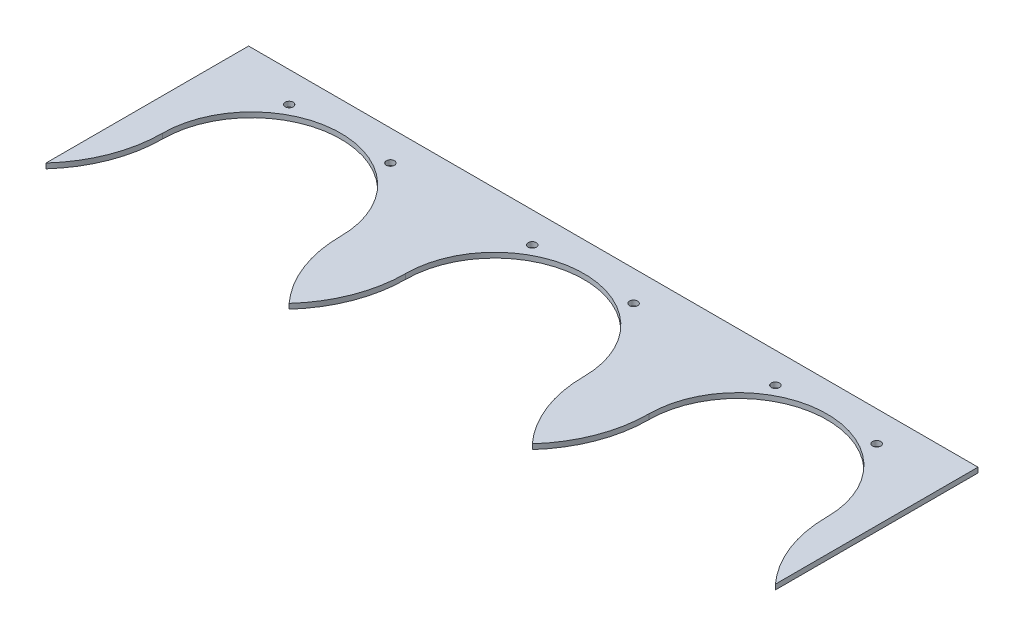
ISO-10303-21;
HEADER;
FILE_DESCRIPTION(('STEP AP214'),'2;1');
FILE_NAME('part.step','',(''),(''),'','','');
FILE_SCHEMA(('AUTOMOTIVE_DESIGN { 1 0 10303 214 1 1 1 1 }'));
ENDSEC;
DATA;
#1=APPLICATION_CONTEXT('core data for automotive mechanical design processes');
#2=APPLICATION_PROTOCOL_DEFINITION('international standard','automotive_design',2000,#1);
#3=PRODUCT_CONTEXT('',#1,'mechanical');
#4=PRODUCT('Part','Part','',(#3));
#5=PRODUCT_RELATED_PRODUCT_CATEGORY('part','',(#4));
#6=PRODUCT_DEFINITION_FORMATION('','',#4);
#7=PRODUCT_DEFINITION_CONTEXT('part definition',#1,'design');
#8=PRODUCT_DEFINITION('design','',#6,#7);
#9=PRODUCT_DEFINITION_SHAPE('','',#8);
#10=(LENGTH_UNIT() NAMED_UNIT(*) SI_UNIT(.MILLI.,.METRE.));
#11=(NAMED_UNIT(*) PLANE_ANGLE_UNIT() SI_UNIT($,.RADIAN.));
#12=(NAMED_UNIT(*) SI_UNIT($,.STERADIAN.) SOLID_ANGLE_UNIT());
#13=UNCERTAINTY_MEASURE_WITH_UNIT(LENGTH_MEASURE(1.E-05),#10,'distance_accuracy_value','');
#14=(GEOMETRIC_REPRESENTATION_CONTEXT(3) GLOBAL_UNCERTAINTY_ASSIGNED_CONTEXT((#13)) GLOBAL_UNIT_ASSIGNED_CONTEXT((#10,
#11,#12)) REPRESENTATION_CONTEXT('',''));
#15=CARTESIAN_POINT('',(0.,0.,0.));
#16=DIRECTION('',(0.,0.,1.));
#17=DIRECTION('',(1.,0.,0.));
#18=AXIS2_PLACEMENT_3D('',#15,#16,#17);
#19=CARTESIAN_POINT('',(-203.873238202378,-3.175,11.6934234359103));
#20=DIRECTION('',(0.,1.,0.));
#21=DIRECTION('',(0.,0.,1.));
#22=AXIS2_PLACEMENT_3D('',#19,#20,#21);
#23=CYLINDRICAL_SURFACE('',#22,55.88);
#24=CARTESIAN_POINT('',(-203.873238202378,0.,11.6934234359103));
#25=DIRECTION('',(0.,1.,0.));
#26=DIRECTION('',(0.,0.,1.));
#27=AXIS2_PLACEMENT_3D('',#24,#25,#26);
#28=CIRCLE('',#27,55.88);
#29=CARTESIAN_POINT('',(-147.993238202378,0.,11.6934234359104));
#30=VERTEX_POINT('',#29);
#31=CARTESIAN_POINT('',(-259.753238202378,0.,11.6934234359103));
#32=VERTEX_POINT('',#31);
#33=EDGE_CURVE('E174',#30,#32,#28,.T.);
#34=ORIENTED_EDGE('',*,*,#33,.T.);
#35=DIRECTION('',(0.,1.,0.));
#36=VECTOR('',#35,1.);
#37=CARTESIAN_POINT('',(-259.753238202378,-3.175,11.6934234359103));
#38=LINE('',#37,#36);
#39=CARTESIAN_POINT('',(-259.753238202378,-3.175,11.6934234359103));
#40=VERTEX_POINT('',#39);
#41=EDGE_CURVE('E11',#40,#32,#38,.T.);
#42=ORIENTED_EDGE('',*,*,#41,.F.);
#43=CARTESIAN_POINT('',(-203.873238202378,-3.175,11.6934234359103));
#44=DIRECTION('',(0.,1.,0.));
#45=DIRECTION('',(0.,0.,1.));
#46=AXIS2_PLACEMENT_3D('',#43,#44,#45);
#47=CIRCLE('',#46,55.88);
#48=CARTESIAN_POINT('',(-147.993238202378,-3.175,11.6934234359104));
#49=VERTEX_POINT('',#48);
#50=EDGE_CURVE('E235',#49,#40,#47,.T.);
#51=ORIENTED_EDGE('',*,*,#50,.F.);
#52=DIRECTION('',(0.,1.,0.));
#53=VECTOR('',#52,1.);
#54=CARTESIAN_POINT('',(-147.993238202378,-3.175,11.6934234359104));
#55=LINE('',#54,#53);
#56=EDGE_CURVE('E40',#49,#30,#55,.T.);
#57=ORIENTED_EDGE('',*,*,#56,.T.);
#58=EDGE_LOOP('',(#34,#42,#51,#57));
#59=FACE_BOUND('',#58,.T.);
#60=ADVANCED_FACE('F36',(#59),#23,.F.);
#61=CARTESIAN_POINT('',(-338.265035077378,-3.175,11.6934234359103));
#62=DIRECTION('',(0.,1.,0.));
#63=DIRECTION('',(0.,0.,1.));
#64=AXIS2_PLACEMENT_3D('',#61,#62,#63);
#65=CYLINDRICAL_SURFACE('',#64,78.511796875);
#66=CARTESIAN_POINT('',(-338.265035077378,0.,11.6934234359103));
#67=DIRECTION('',(0.,1.,0.));
#68=DIRECTION('',(0.,0.,1.));
#69=AXIS2_PLACEMENT_3D('',#66,#67,#68);
#70=CIRCLE('',#69,78.511796875);
#71=CARTESIAN_POINT('',(-280.073238202378,0.,64.3984234359103));
#72=VERTEX_POINT('',#71);
#73=EDGE_CURVE('E100',#32,#72,#70,.F.);
#74=ORIENTED_EDGE('',*,*,#73,.T.);
#75=DIRECTION('',(0.,1.,0.));
#76=VECTOR('',#75,1.);
#77=CARTESIAN_POINT('',(-280.073238202378,-3.175,64.3984234359103));
#78=LINE('',#77,#76);
#79=CARTESIAN_POINT('',(-280.073238202378,-3.175,64.3984234359103));
#80=VERTEX_POINT('',#79);
#81=EDGE_CURVE('E46',#80,#72,#78,.T.);
#82=ORIENTED_EDGE('',*,*,#81,.F.);
#83=CARTESIAN_POINT('',(-338.265035077378,-3.175,11.6934234359103));
#84=DIRECTION('',(0.,1.,0.));
#85=DIRECTION('',(0.,0.,1.));
#86=AXIS2_PLACEMENT_3D('',#83,#84,#85);
#87=CIRCLE('',#86,78.511796875);
#88=EDGE_CURVE('E54',#40,#80,#87,.F.);
#89=ORIENTED_EDGE('',*,*,#88,.F.);
#90=ORIENTED_EDGE('',*,*,#41,.T.);
#91=EDGE_LOOP('',(#74,#82,#89,#90));
#92=FACE_BOUND('',#91,.T.);
#93=ADVANCED_FACE('F256',(#92),#65,.T.);
#94=CARTESIAN_POINT('',(-280.073238202378,-3.175,2.48592343591035));
#95=DIRECTION('',(-1.,0.,0.));
#96=DIRECTION('',(0.,0.,1.));
#97=AXIS2_PLACEMENT_3D('',#94,#95,#96);
#98=PLANE('',#97);
#99=DIRECTION('',(0.,0.,1.));
#100=VECTOR('',#99,1.);
#101=CARTESIAN_POINT('',(-280.073238202378,0.,2.48592343591035));
#102=LINE('',#101,#100);
#103=CARTESIAN_POINT('',(-280.073238202378,0.,-62.6015765640897));
#104=VERTEX_POINT('',#103);
#105=EDGE_CURVE('E137',#104,#72,#102,.T.);
#106=ORIENTED_EDGE('',*,*,#105,.F.);
#107=DIRECTION('',(0.,1.,0.));
#108=VECTOR('',#107,1.);
#109=CARTESIAN_POINT('',(-280.073238202378,-3.175,-62.6015765640897));
#110=LINE('',#109,#108);
#111=CARTESIAN_POINT('',(-280.073238202378,-3.175,-62.6015765640897));
#112=VERTEX_POINT('',#111);
#113=EDGE_CURVE('E132',#112,#104,#110,.T.);
#114=ORIENTED_EDGE('',*,*,#113,.F.);
#115=DIRECTION('',(0.,0.,1.));
#116=VECTOR('',#115,1.);
#117=CARTESIAN_POINT('',(-280.073238202378,-3.175,2.48592343591035));
#118=LINE('',#117,#116);
#119=EDGE_CURVE('E136',#112,#80,#118,.T.);
#120=ORIENTED_EDGE('',*,*,#119,.T.);
#121=ORIENTED_EDGE('',*,*,#81,.T.);
#122=EDGE_LOOP('',(#106,#114,#120,#121));
#123=FACE_BOUND('',#122,.T.);
#124=ADVANCED_FACE('F134',(#123),#98,.T.);
#125=CARTESIAN_POINT('',(-421.366345461635,-3.175,-62.6015765640897));
#126=DIRECTION('',(0.,0.,1.));
#127=DIRECTION('',(1.,0.,0.));
#128=AXIS2_PLACEMENT_3D('',#125,#126,#127);
#129=PLANE('',#128);
#130=DIRECTION('',(1.,0.,0.));
#131=VECTOR('',#130,1.);
#132=CARTESIAN_POINT('',(-421.366345461635,0.,-62.6015765640897));
#133=LINE('',#132,#131);
#134=CARTESIAN_POINT('',(177.126761797622,0.,-62.6015765640897));
#135=VERTEX_POINT('',#134);
#136=EDGE_CURVE('E199',#104,#135,#133,.T.);
#137=ORIENTED_EDGE('',*,*,#136,.T.);
#138=DIRECTION('',(0.,1.,0.));
#139=VECTOR('',#138,1.);
#140=CARTESIAN_POINT('',(177.126761797622,-3.175,-62.6015765640897));
#141=LINE('',#140,#139);
#142=CARTESIAN_POINT('',(177.126761797622,-3.175,-62.6015765640897));
#143=VERTEX_POINT('',#142);
#144=EDGE_CURVE('E140',#143,#135,#141,.T.);
#145=ORIENTED_EDGE('',*,*,#144,.F.);
#146=DIRECTION('',(1.,0.,0.));
#147=VECTOR('',#146,1.);
#148=CARTESIAN_POINT('',(-421.366345461635,-3.175,-62.6015765640897));
#149=LINE('',#148,#147);
#150=EDGE_CURVE('E143',#112,#143,#149,.T.);
#151=ORIENTED_EDGE('',*,*,#150,.F.);
#152=ORIENTED_EDGE('',*,*,#113,.T.);
#153=EDGE_LOOP('',(#137,#145,#151,#152));
#154=FACE_BOUND('',#153,.T.);
#155=ADVANCED_FACE('F144',(#154),#129,.F.);
#156=CARTESIAN_POINT('',(177.126761797622,-3.175,2.48592343591022));
#157=DIRECTION('',(-1.,0.,0.));
#158=DIRECTION('',(0.,0.,1.));
#159=AXIS2_PLACEMENT_3D('',#156,#157,#158);
#160=PLANE('',#159);
#161=DIRECTION('',(0.,0.,1.));
#162=VECTOR('',#161,1.);
#163=CARTESIAN_POINT('',(177.126761797622,0.,2.48592343591022));
#164=LINE('',#163,#162);
#165=CARTESIAN_POINT('',(177.126761797622,0.,64.3984234359103));
#166=VERTEX_POINT('',#165);
#167=EDGE_CURVE('E196',#135,#166,#164,.T.);
#168=ORIENTED_EDGE('',*,*,#167,.T.);
#169=DIRECTION('',(0.,1.,0.));
#170=VECTOR('',#169,1.);
#171=CARTESIAN_POINT('',(177.126761797622,-3.175,64.3984234359103));
#172=LINE('',#171,#170);
#173=CARTESIAN_POINT('',(177.126761797622,-3.175,64.3984234359103));
#174=VERTEX_POINT('',#173);
#175=EDGE_CURVE('E218',#174,#166,#172,.T.);
#176=ORIENTED_EDGE('',*,*,#175,.F.);
#177=DIRECTION('',(0.,0.,1.));
#178=VECTOR('',#177,1.);
#179=CARTESIAN_POINT('',(177.126761797622,-3.175,2.48592343591022));
#180=LINE('',#179,#178);
#181=EDGE_CURVE('E148',#143,#174,#180,.T.);
#182=ORIENTED_EDGE('',*,*,#181,.F.);
#183=ORIENTED_EDGE('',*,*,#144,.T.);
#184=EDGE_LOOP('',(#168,#176,#182,#183));
#185=FACE_BOUND('',#184,.T.);
#186=ADVANCED_FACE('F269',(#185),#160,.F.);
#187=CARTESIAN_POINT('',(235.318558672622,-3.175,11.6934234359103));
#188=DIRECTION('',(0.,1.,0.));
#189=DIRECTION('',(0.,0.,1.));
#190=AXIS2_PLACEMENT_3D('',#187,#188,#189);
#191=CYLINDRICAL_SURFACE('',#190,78.5117968750001);
#192=CARTESIAN_POINT('',(235.318558672622,0.,11.6934234359103));
#193=DIRECTION('',(0.,1.,0.));
#194=DIRECTION('',(0.,0.,1.));
#195=AXIS2_PLACEMENT_3D('',#192,#193,#194);
#196=CIRCLE('',#195,78.5117968750001);
#197=CARTESIAN_POINT('',(156.806761797622,0.,11.6934234359103));
#198=VERTEX_POINT('',#197);
#199=EDGE_CURVE('E193',#198,#166,#196,.T.);
#200=ORIENTED_EDGE('',*,*,#199,.F.);
#201=DIRECTION('',(0.,1.,0.));
#202=VECTOR('',#201,1.);
#203=CARTESIAN_POINT('',(156.806761797622,-3.175,11.6934234359103));
#204=LINE('',#203,#202);
#205=CARTESIAN_POINT('',(156.806761797622,-3.175,11.6934234359103));
#206=VERTEX_POINT('',#205);
#207=EDGE_CURVE('E220',#206,#198,#204,.T.);
#208=ORIENTED_EDGE('',*,*,#207,.F.);
#209=CARTESIAN_POINT('',(235.318558672622,-3.175,11.6934234359103));
#210=DIRECTION('',(0.,1.,0.));
#211=DIRECTION('',(0.,0.,1.));
#212=AXIS2_PLACEMENT_3D('',#209,#210,#211);
#213=CIRCLE('',#212,78.5117968750001);
#214=EDGE_CURVE('E320',#206,#174,#213,.T.);
#215=ORIENTED_EDGE('',*,*,#214,.T.);
#216=ORIENTED_EDGE('',*,*,#175,.T.);
#217=EDGE_LOOP('',(#200,#208,#215,#216));
#218=FACE_BOUND('',#217,.T.);
#219=ADVANCED_FACE('F272',(#218),#191,.T.);
#220=CARTESIAN_POINT('',(100.926761797622,-3.175,11.6934234359103));
#221=DIRECTION('',(0.,1.,0.));
#222=DIRECTION('',(0.,0.,1.));
#223=AXIS2_PLACEMENT_3D('',#220,#221,#222);
#224=CYLINDRICAL_SURFACE('',#223,55.88);
#225=CARTESIAN_POINT('',(100.926761797622,0.,11.6934234359103));
#226=DIRECTION('',(0.,1.,0.));
#227=DIRECTION('',(0.,0.,1.));
#228=AXIS2_PLACEMENT_3D('',#225,#226,#227);
#229=CIRCLE('',#228,55.88);
#230=CARTESIAN_POINT('',(45.046761797622,0.,11.6934234359103));
#231=VERTEX_POINT('',#230);
#232=EDGE_CURVE('E191',#198,#231,#229,.T.);
#233=ORIENTED_EDGE('',*,*,#232,.T.);
#234=DIRECTION('',(0.,1.,0.));
#235=VECTOR('',#234,1.);
#236=CARTESIAN_POINT('',(45.046761797622,-3.175,11.6934234359103));
#237=LINE('',#236,#235);
#238=CARTESIAN_POINT('',(45.046761797622,-3.175,11.6934234359103));
#239=VERTEX_POINT('',#238);
#240=EDGE_CURVE('E222',#239,#231,#237,.T.);
#241=ORIENTED_EDGE('',*,*,#240,.F.);
#242=CARTESIAN_POINT('',(100.926761797622,-3.175,11.6934234359103));
#243=DIRECTION('',(0.,1.,0.));
#244=DIRECTION('',(0.,0.,1.));
#245=AXIS2_PLACEMENT_3D('',#242,#243,#244);
#246=CIRCLE('',#245,55.88);
#247=EDGE_CURVE('E321',#206,#239,#246,.T.);
#248=ORIENTED_EDGE('',*,*,#247,.F.);
#249=ORIENTED_EDGE('',*,*,#207,.T.);
#250=EDGE_LOOP('',(#233,#241,#248,#249));
#251=FACE_BOUND('',#250,.T.);
#252=ADVANCED_FACE('F276',(#251),#224,.F.);
#253=CARTESIAN_POINT('',(-33.4650350773781,-3.175,11.6934234359103));
#254=DIRECTION('',(0.,1.,0.));
#255=DIRECTION('',(0.,0.,1.));
#256=AXIS2_PLACEMENT_3D('',#253,#254,#255);
#257=CYLINDRICAL_SURFACE('',#256,78.5117968750001);
#258=CARTESIAN_POINT('',(-33.4650350773781,0.,11.6934234359103));
#259=DIRECTION('',(0.,1.,0.));
#260=DIRECTION('',(0.,0.,1.));
#261=AXIS2_PLACEMENT_3D('',#258,#259,#260);
#262=CIRCLE('',#261,78.5117968750001);
#263=CARTESIAN_POINT('',(24.726761797622,0.,64.3984234359103));
#264=VERTEX_POINT('',#263);
#265=EDGE_CURVE('E188',#231,#264,#262,.F.);
#266=ORIENTED_EDGE('',*,*,#265,.T.);
#267=DIRECTION('',(0.,1.,0.));
#268=VECTOR('',#267,1.);
#269=CARTESIAN_POINT('',(24.726761797622,-3.175,64.3984234359103));
#270=LINE('',#269,#268);
#271=CARTESIAN_POINT('',(24.726761797622,-3.175,64.3984234359103));
#272=VERTEX_POINT('',#271);
#273=EDGE_CURVE('E225',#272,#264,#270,.T.);
#274=ORIENTED_EDGE('',*,*,#273,.F.);
#275=CARTESIAN_POINT('',(-33.4650350773781,-3.175,11.6934234359103));
#276=DIRECTION('',(0.,1.,0.));
#277=DIRECTION('',(0.,0.,1.));
#278=AXIS2_PLACEMENT_3D('',#275,#276,#277);
#279=CIRCLE('',#278,78.5117968750001);
#280=EDGE_CURVE('E325',#239,#272,#279,.F.);
#281=ORIENTED_EDGE('',*,*,#280,.F.);
#282=ORIENTED_EDGE('',*,*,#240,.T.);
#283=EDGE_LOOP('',(#266,#274,#281,#282));
#284=FACE_BOUND('',#283,.T.);
#285=ADVANCED_FACE('F280',(#284),#257,.T.);
#286=CARTESIAN_POINT('',(82.918558672622,-3.175,11.6934234359103));
#287=DIRECTION('',(0.,1.,0.));
#288=DIRECTION('',(0.,0.,1.));
#289=AXIS2_PLACEMENT_3D('',#286,#287,#288);
#290=CYLINDRICAL_SURFACE('',#289,78.5117968750001);
#291=CARTESIAN_POINT('',(82.918558672622,0.,11.6934234359103));
#292=DIRECTION('',(0.,1.,0.));
#293=DIRECTION('',(0.,0.,1.));
#294=AXIS2_PLACEMENT_3D('',#291,#292,#293);
#295=CIRCLE('',#294,78.5117968750001);
#296=CARTESIAN_POINT('',(4.40676179762195,0.,11.6934234359103));
#297=VERTEX_POINT('',#296);
#298=EDGE_CURVE('E185',#297,#264,#295,.T.);
#299=ORIENTED_EDGE('',*,*,#298,.F.);
#300=DIRECTION('',(0.,1.,0.));
#301=VECTOR('',#300,1.);
#302=CARTESIAN_POINT('',(4.40676179762195,-3.175,11.6934234359103));
#303=LINE('',#302,#301);
#304=CARTESIAN_POINT('',(4.40676179762195,-3.175,11.6934234359103));
#305=VERTEX_POINT('',#304);
#306=EDGE_CURVE('E227',#305,#297,#303,.T.);
#307=ORIENTED_EDGE('',*,*,#306,.F.);
#308=CARTESIAN_POINT('',(82.918558672622,-3.175,11.6934234359103));
#309=DIRECTION('',(0.,1.,0.));
#310=DIRECTION('',(0.,0.,1.));
#311=AXIS2_PLACEMENT_3D('',#308,#309,#310);
#312=CIRCLE('',#311,78.5117968750001);
#313=EDGE_CURVE('E310',#305,#272,#312,.T.);
#314=ORIENTED_EDGE('',*,*,#313,.T.);
#315=ORIENTED_EDGE('',*,*,#273,.T.);
#316=EDGE_LOOP('',(#299,#307,#314,#315));
#317=FACE_BOUND('',#316,.T.);
#318=ADVANCED_FACE('F284',(#317),#290,.T.);
#319=CARTESIAN_POINT('',(-51.473238202378,-3.175,11.6934234359103));
#320=DIRECTION('',(0.,1.,0.));
#321=DIRECTION('',(0.,0.,1.));
#322=AXIS2_PLACEMENT_3D('',#319,#320,#321);
#323=CYLINDRICAL_SURFACE('',#322,55.88);
#324=CARTESIAN_POINT('',(-51.473238202378,0.,11.6934234359103));
#325=DIRECTION('',(0.,1.,0.));
#326=DIRECTION('',(0.,0.,1.));
#327=AXIS2_PLACEMENT_3D('',#324,#325,#326);
#328=CIRCLE('',#327,55.88);
#329=CARTESIAN_POINT('',(-107.353238202378,0.,11.6934234359103));
#330=VERTEX_POINT('',#329);
#331=EDGE_CURVE('E183',#297,#330,#328,.T.);
#332=ORIENTED_EDGE('',*,*,#331,.T.);
#333=DIRECTION('',(0.,1.,0.));
#334=VECTOR('',#333,1.);
#335=CARTESIAN_POINT('',(-107.353238202378,-3.175,11.6934234359103));
#336=LINE('',#335,#334);
#337=CARTESIAN_POINT('',(-107.353238202378,-3.175,11.6934234359103));
#338=VERTEX_POINT('',#337);
#339=EDGE_CURVE('E229',#338,#330,#336,.T.);
#340=ORIENTED_EDGE('',*,*,#339,.F.);
#341=CARTESIAN_POINT('',(-51.473238202378,-3.175,11.6934234359103));
#342=DIRECTION('',(0.,1.,0.));
#343=DIRECTION('',(0.,0.,1.));
#344=AXIS2_PLACEMENT_3D('',#341,#342,#343);
#345=CIRCLE('',#344,55.88);
#346=EDGE_CURVE('E328',#305,#338,#345,.T.);
#347=ORIENTED_EDGE('',*,*,#346,.F.);
#348=ORIENTED_EDGE('',*,*,#306,.T.);
#349=EDGE_LOOP('',(#332,#340,#347,#348));
#350=FACE_BOUND('',#349,.T.);
#351=ADVANCED_FACE('F288',(#350),#323,.F.);
#352=CARTESIAN_POINT('',(-185.865035077378,-3.175,11.6934234359103));
#353=DIRECTION('',(0.,1.,0.));
#354=DIRECTION('',(0.,0.,1.));
#355=AXIS2_PLACEMENT_3D('',#352,#353,#354);
#356=CYLINDRICAL_SURFACE('',#355,78.5117968749999);
#357=CARTESIAN_POINT('',(-185.865035077378,0.,11.6934234359103));
#358=DIRECTION('',(0.,1.,0.));
#359=DIRECTION('',(0.,0.,1.));
#360=AXIS2_PLACEMENT_3D('',#357,#358,#359);
#361=CIRCLE('',#360,78.5117968749999);
#362=CARTESIAN_POINT('',(-127.673238202378,0.,64.3984234359103));
#363=VERTEX_POINT('',#362);
#364=EDGE_CURVE('E180',#330,#363,#361,.F.);
#365=ORIENTED_EDGE('',*,*,#364,.T.);
#366=DIRECTION('',(0.,1.,0.));
#367=VECTOR('',#366,1.);
#368=CARTESIAN_POINT('',(-127.673238202378,-3.175,64.3984234359103));
#369=LINE('',#368,#367);
#370=CARTESIAN_POINT('',(-127.673238202378,-3.175,64.3984234359103));
#371=VERTEX_POINT('',#370);
#372=EDGE_CURVE('E231',#371,#363,#369,.T.);
#373=ORIENTED_EDGE('',*,*,#372,.F.);
#374=CARTESIAN_POINT('',(-185.865035077378,-3.175,11.6934234359103));
#375=DIRECTION('',(0.,1.,0.));
#376=DIRECTION('',(0.,0.,1.));
#377=AXIS2_PLACEMENT_3D('',#374,#375,#376);
#378=CIRCLE('',#377,78.5117968749999);
#379=EDGE_CURVE('E330',#338,#371,#378,.F.);
#380=ORIENTED_EDGE('',*,*,#379,.F.);
#381=ORIENTED_EDGE('',*,*,#339,.T.);
#382=EDGE_LOOP('',(#365,#373,#380,#381));
#383=FACE_BOUND('',#382,.T.);
#384=ADVANCED_FACE('F291',(#383),#356,.T.);
#385=CARTESIAN_POINT('',(132.676761797622,-3.175,-43.5515765640897));
#386=DIRECTION('',(0.,1.,0.));
#387=DIRECTION('',(0.,0.,1.));
#388=AXIS2_PLACEMENT_3D('',#385,#386,#387);
#389=CYLINDRICAL_SURFACE('',#388,2.53999999999998);
#390=CARTESIAN_POINT('',(132.676761797622,-3.175,-43.5515765640897));
#391=DIRECTION('',(0.,1.,0.));
#392=DIRECTION('',(0.,0.,1.));
#393=AXIS2_PLACEMENT_3D('',#390,#391,#392);
#394=CIRCLE('',#393,2.53999999999998);
#395=CARTESIAN_POINT('',(132.676761797622,-3.175,-41.0115765640897));
#396=VERTEX_POINT('',#395);
#397=EDGE_CURVE('E162',#396,#396,#394,.T.);
#398=ORIENTED_EDGE('',*,*,#397,.F.);
#399=EDGE_LOOP('',(#398));
#400=FACE_BOUND('',#399,.T.);
#401=CARTESIAN_POINT('',(132.676761797622,0.,-43.5515765640897));
#402=DIRECTION('',(0.,1.,0.));
#403=DIRECTION('',(0.,0.,1.));
#404=AXIS2_PLACEMENT_3D('',#401,#402,#403);
#405=CIRCLE('',#404,2.53999999999998);
#406=CARTESIAN_POINT('',(132.676761797622,0.,-41.0115765640897));
#407=VERTEX_POINT('',#406);
#408=EDGE_CURVE('E209',#407,#407,#405,.T.);
#409=ORIENTED_EDGE('',*,*,#408,.T.);
#410=EDGE_LOOP('',(#409));
#411=FACE_BOUND('',#410,.T.);
#412=ADVANCED_FACE('F294',(#400,#411),#389,.F.);
#413=CARTESIAN_POINT('',(-83.2232382023781,-3.175,-43.5515765640897));
#414=DIRECTION('',(0.,1.,0.));
#415=DIRECTION('',(0.,0.,1.));
#416=AXIS2_PLACEMENT_3D('',#413,#414,#415);
#417=CYLINDRICAL_SURFACE('',#416,2.54);
#418=CARTESIAN_POINT('',(-83.2232382023781,-3.175,-43.5515765640897));
#419=DIRECTION('',(0.,1.,0.));
#420=DIRECTION('',(0.,0.,1.));
#421=AXIS2_PLACEMENT_3D('',#418,#419,#420);
#422=CIRCLE('',#421,2.54);
#423=CARTESIAN_POINT('',(-83.2232382023781,-3.175,-41.0115765640897));
#424=VERTEX_POINT('',#423);
#425=EDGE_CURVE('E159',#424,#424,#422,.T.);
#426=ORIENTED_EDGE('',*,*,#425,.F.);
#427=EDGE_LOOP('',(#426));
#428=FACE_BOUND('',#427,.T.);
#429=CARTESIAN_POINT('',(-83.2232382023781,0.,-43.5515765640897));
#430=DIRECTION('',(0.,1.,0.));
#431=DIRECTION('',(0.,0.,1.));
#432=AXIS2_PLACEMENT_3D('',#429,#430,#431);
#433=CIRCLE('',#432,2.54);
#434=CARTESIAN_POINT('',(-83.2232382023781,0.,-41.0115765640897));
#435=VERTEX_POINT('',#434);
#436=EDGE_CURVE('E206',#435,#435,#433,.T.);
#437=ORIENTED_EDGE('',*,*,#436,.T.);
#438=EDGE_LOOP('',(#437));
#439=FACE_BOUND('',#438,.T.);
#440=ADVANCED_FACE('F250',(#428,#439),#417,.F.);
#441=CARTESIAN_POINT('',(-19.723238202378,-3.175,-43.5515765640897));
#442=DIRECTION('',(0.,1.,0.));
#443=DIRECTION('',(0.,0.,1.));
#444=AXIS2_PLACEMENT_3D('',#441,#442,#443);
#445=CYLINDRICAL_SURFACE('',#444,2.54);
#446=CARTESIAN_POINT('',(-19.723238202378,-3.175,-43.5515765640897));
#447=DIRECTION('',(0.,1.,0.));
#448=DIRECTION('',(0.,0.,1.));
#449=AXIS2_PLACEMENT_3D('',#446,#447,#448);
#450=CIRCLE('',#449,2.54);
#451=CARTESIAN_POINT('',(-19.723238202378,-3.175,-41.0115765640897));
#452=VERTEX_POINT('',#451);
#453=EDGE_CURVE('E153',#452,#452,#450,.T.);
#454=ORIENTED_EDGE('',*,*,#453,.F.);
#455=EDGE_LOOP('',(#454));
#456=FACE_BOUND('',#455,.T.);
#457=CARTESIAN_POINT('',(-19.723238202378,0.,-43.5515765640897));
#458=DIRECTION('',(0.,1.,0.));
#459=DIRECTION('',(0.,0.,1.));
#460=AXIS2_PLACEMENT_3D('',#457,#458,#459);
#461=CIRCLE('',#460,2.54);
#462=CARTESIAN_POINT('',(-19.723238202378,0.,-41.0115765640897));
#463=VERTEX_POINT('',#462);
#464=EDGE_CURVE('E203',#463,#463,#461,.T.);
#465=ORIENTED_EDGE('',*,*,#464,.T.);
#466=EDGE_LOOP('',(#465));
#467=FACE_BOUND('',#466,.T.);
#468=ADVANCED_FACE('F243',(#456,#467),#445,.F.);
#469=CARTESIAN_POINT('',(-69.4814413273784,-3.175,11.6934234359105));
#470=DIRECTION('',(0.,1.,0.));
#471=DIRECTION('',(0.,0.,1.));
#472=AXIS2_PLACEMENT_3D('',#469,#470,#471);
#473=CYLINDRICAL_SURFACE('',#472,78.5117968749996);
#474=CARTESIAN_POINT('',(-69.4814413273784,0.,11.6934234359105));
#475=DIRECTION('',(0.,1.,0.));
#476=DIRECTION('',(0.,0.,1.));
#477=AXIS2_PLACEMENT_3D('',#474,#475,#476);
#478=CIRCLE('',#477,78.5117968749996);
#479=EDGE_CURVE('E177',#30,#363,#478,.T.);
#480=ORIENTED_EDGE('',*,*,#479,.F.);
#481=ORIENTED_EDGE('',*,*,#56,.F.);
#482=CARTESIAN_POINT('',(-69.4814413273784,-3.175,11.6934234359105));
#483=DIRECTION('',(0.,1.,0.));
#484=DIRECTION('',(0.,0.,1.));
#485=AXIS2_PLACEMENT_3D('',#482,#483,#484);
#486=CIRCLE('',#485,78.5117968749996);
#487=EDGE_CURVE('E332',#49,#371,#486,.T.);
#488=ORIENTED_EDGE('',*,*,#487,.T.);
#489=ORIENTED_EDGE('',*,*,#372,.T.);
#490=EDGE_LOOP('',(#480,#481,#488,#489));
#491=FACE_BOUND('',#490,.T.);
#492=ADVANCED_FACE('F240',(#491),#473,.T.);
#493=CARTESIAN_POINT('',(-235.623238202378,-3.175,-43.5515765640897));
#494=DIRECTION('',(0.,1.,0.));
#495=DIRECTION('',(0.,0.,1.));
#496=AXIS2_PLACEMENT_3D('',#493,#494,#495);
#497=CYLINDRICAL_SURFACE('',#496,2.53999999999998);
#498=CARTESIAN_POINT('',(-235.623238202378,-3.175,-43.5515765640897));
#499=DIRECTION('',(0.,1.,0.));
#500=DIRECTION('',(0.,0.,1.));
#501=AXIS2_PLACEMENT_3D('',#498,#499,#500);
#502=CIRCLE('',#501,2.53999999999998);
#503=CARTESIAN_POINT('',(-235.623238202378,-3.175,-41.0115765640897));
#504=VERTEX_POINT('',#503);
#505=EDGE_CURVE('E335',#504,#504,#502,.T.);
#506=ORIENTED_EDGE('',*,*,#505,.F.);
#507=EDGE_LOOP('',(#506));
#508=FACE_BOUND('',#507,.T.);
#509=CARTESIAN_POINT('',(-235.623238202378,0.,-43.5515765640897));
#510=DIRECTION('',(0.,1.,0.));
#511=DIRECTION('',(0.,0.,1.));
#512=AXIS2_PLACEMENT_3D('',#509,#510,#511);
#513=CIRCLE('',#512,2.53999999999998);
#514=CARTESIAN_POINT('',(-235.623238202378,0.,-41.0115765640897));
#515=VERTEX_POINT('',#514);
#516=EDGE_CURVE('E171',#515,#515,#513,.T.);
#517=ORIENTED_EDGE('',*,*,#516,.T.);
#518=EDGE_LOOP('',(#517));
#519=FACE_BOUND('',#518,.T.);
#520=ADVANCED_FACE('F242',(#508,#519),#497,.F.);
#521=CARTESIAN_POINT('',(-172.123238202378,-3.175,-43.5515765640897));
#522=DIRECTION('',(0.,1.,0.));
#523=DIRECTION('',(0.,0.,1.));
#524=AXIS2_PLACEMENT_3D('',#521,#522,#523);
#525=CYLINDRICAL_SURFACE('',#524,2.53999999999998);
#526=CARTESIAN_POINT('',(-172.123238202378,-3.175,-43.5515765640897));
#527=DIRECTION('',(0.,1.,0.));
#528=DIRECTION('',(0.,0.,1.));
#529=AXIS2_PLACEMENT_3D('',#526,#527,#528);
#530=CIRCLE('',#529,2.53999999999998);
#531=CARTESIAN_POINT('',(-172.123238202378,-3.175,-41.0115765640897));
#532=VERTEX_POINT('',#531);
#533=EDGE_CURVE('E214',#532,#532,#530,.T.);
#534=ORIENTED_EDGE('',*,*,#533,.F.);
#535=EDGE_LOOP('',(#534));
#536=FACE_BOUND('',#535,.T.);
#537=CARTESIAN_POINT('',(-172.123238202378,0.,-43.5515765640897));
#538=DIRECTION('',(0.,1.,0.));
#539=DIRECTION('',(0.,0.,1.));
#540=AXIS2_PLACEMENT_3D('',#537,#538,#539);
#541=CIRCLE('',#540,2.53999999999998);
#542=CARTESIAN_POINT('',(-172.123238202378,0.,-41.0115765640897));
#543=VERTEX_POINT('',#542);
#544=EDGE_CURVE('E168',#543,#543,#541,.T.);
#545=ORIENTED_EDGE('',*,*,#544,.T.);
#546=EDGE_LOOP('',(#545));
#547=FACE_BOUND('',#546,.T.);
#548=ADVANCED_FACE('F38',(#536,#547),#525,.F.);
#549=CARTESIAN_POINT('',(69.1767617976219,-3.175,-43.5515765640897));
#550=DIRECTION('',(0.,1.,0.));
#551=DIRECTION('',(0.,0.,1.));
#552=AXIS2_PLACEMENT_3D('',#549,#550,#551);
#553=CYLINDRICAL_SURFACE('',#552,2.54);
#554=CARTESIAN_POINT('',(69.1767617976219,-3.175,-43.5515765640897));
#555=DIRECTION('',(0.,1.,0.));
#556=DIRECTION('',(0.,0.,1.));
#557=AXIS2_PLACEMENT_3D('',#554,#555,#556);
#558=CIRCLE('',#557,2.54);
#559=CARTESIAN_POINT('',(69.1767617976219,-3.175,-41.0115765640897));
#560=VERTEX_POINT('',#559);
#561=EDGE_CURVE('E165',#560,#560,#558,.T.);
#562=ORIENTED_EDGE('',*,*,#561,.F.);
#563=EDGE_LOOP('',(#562));
#564=FACE_BOUND('',#563,.T.);
#565=CARTESIAN_POINT('',(69.1767617976219,0.,-43.5515765640897));
#566=DIRECTION('',(0.,1.,0.));
#567=DIRECTION('',(0.,0.,1.));
#568=AXIS2_PLACEMENT_3D('',#565,#566,#567);
#569=CIRCLE('',#568,2.54);
#570=CARTESIAN_POINT('',(69.1767617976219,0.,-41.0115765640897));
#571=VERTEX_POINT('',#570);
#572=EDGE_CURVE('E212',#571,#571,#569,.T.);
#573=ORIENTED_EDGE('',*,*,#572,.T.);
#574=EDGE_LOOP('',(#573));
#575=FACE_BOUND('',#574,.T.);
#576=ADVANCED_FACE('F345',(#564,#575),#553,.F.);
#577=CARTESIAN_POINT('',(-421.366345461635,-3.175,2.48592343591035));
#578=DIRECTION('',(0.,1.,0.));
#579=DIRECTION('',(0.,0.,1.));
#580=AXIS2_PLACEMENT_3D('',#577,#578,#579);
#581=PLANE('',#580);
#582=ORIENTED_EDGE('',*,*,#533,.T.);
#583=EDGE_LOOP('',(#582));
#584=FACE_BOUND('',#583,.T.);
#585=ORIENTED_EDGE('',*,*,#505,.T.);
#586=EDGE_LOOP('',(#585));
#587=FACE_BOUND('',#586,.T.);
#588=ORIENTED_EDGE('',*,*,#50,.T.);
#589=ORIENTED_EDGE('',*,*,#88,.T.);
#590=ORIENTED_EDGE('',*,*,#119,.F.);
#591=ORIENTED_EDGE('',*,*,#150,.T.);
#592=ORIENTED_EDGE('',*,*,#181,.T.);
#593=ORIENTED_EDGE('',*,*,#214,.F.);
#594=ORIENTED_EDGE('',*,*,#247,.T.);
#595=ORIENTED_EDGE('',*,*,#280,.T.);
#596=ORIENTED_EDGE('',*,*,#313,.F.);
#597=ORIENTED_EDGE('',*,*,#346,.T.);
#598=ORIENTED_EDGE('',*,*,#379,.T.);
#599=ORIENTED_EDGE('',*,*,#487,.F.);
#600=EDGE_LOOP('',(#588,#589,#590,#591,#592,#593,#594,#595,#596,#597,#598,#599));
#601=FACE_BOUND('',#600,.T.);
#602=ORIENTED_EDGE('',*,*,#453,.T.);
#603=EDGE_LOOP('',(#602));
#604=FACE_BOUND('',#603,.T.);
#605=ORIENTED_EDGE('',*,*,#425,.T.);
#606=EDGE_LOOP('',(#605));
#607=FACE_BOUND('',#606,.T.);
#608=ORIENTED_EDGE('',*,*,#397,.T.);
#609=EDGE_LOOP('',(#608));
#610=FACE_BOUND('',#609,.T.);
#611=ORIENTED_EDGE('',*,*,#561,.T.);
#612=EDGE_LOOP('',(#611));
#613=FACE_BOUND('',#612,.T.);
#614=ADVANCED_FACE('F150',(#584,#587,#601,#604,#607,#610,#613),#581,.F.);
#615=CARTESIAN_POINT('',(-421.366345461635,0.,2.48592343591035));
#616=DIRECTION('',(0.,1.,0.));
#617=DIRECTION('',(0.,0.,1.));
#618=AXIS2_PLACEMENT_3D('',#615,#616,#617);
#619=PLANE('',#618);
#620=ORIENTED_EDGE('',*,*,#544,.F.);
#621=EDGE_LOOP('',(#620));
#622=FACE_BOUND('',#621,.T.);
#623=ORIENTED_EDGE('',*,*,#516,.F.);
#624=EDGE_LOOP('',(#623));
#625=FACE_BOUND('',#624,.T.);
#626=ORIENTED_EDGE('',*,*,#33,.F.);
#627=ORIENTED_EDGE('',*,*,#479,.T.);
#628=ORIENTED_EDGE('',*,*,#364,.F.);
#629=ORIENTED_EDGE('',*,*,#331,.F.);
#630=ORIENTED_EDGE('',*,*,#298,.T.);
#631=ORIENTED_EDGE('',*,*,#265,.F.);
#632=ORIENTED_EDGE('',*,*,#232,.F.);
#633=ORIENTED_EDGE('',*,*,#199,.T.);
#634=ORIENTED_EDGE('',*,*,#167,.F.);
#635=ORIENTED_EDGE('',*,*,#136,.F.);
#636=ORIENTED_EDGE('',*,*,#105,.T.);
#637=ORIENTED_EDGE('',*,*,#73,.F.);
#638=EDGE_LOOP('',(#626,#627,#628,#629,#630,#631,#632,#633,#634,#635,#636,#637));
#639=FACE_BOUND('',#638,.T.);
#640=ORIENTED_EDGE('',*,*,#464,.F.);
#641=EDGE_LOOP('',(#640));
#642=FACE_BOUND('',#641,.T.);
#643=ORIENTED_EDGE('',*,*,#436,.F.);
#644=EDGE_LOOP('',(#643));
#645=FACE_BOUND('',#644,.T.);
#646=ORIENTED_EDGE('',*,*,#408,.F.);
#647=EDGE_LOOP('',(#646));
#648=FACE_BOUND('',#647,.T.);
#649=ORIENTED_EDGE('',*,*,#572,.F.);
#650=EDGE_LOOP('',(#649));
#651=FACE_BOUND('',#650,.T.);
#652=ADVANCED_FACE('F237',(#622,#625,#639,#642,#645,#648,#651),#619,.T.);
#653=CLOSED_SHELL('',(#60,#93,#124,#155,#186,#219,#252,#285,#318,#351,#384,#412,#440,#468,#492,
#520,#548,#576,#614,#652));
#654=MANIFOLD_SOLID_BREP('B2',#653);
#655=ADVANCED_BREP_SHAPE_REPRESENTATION('',(#18,#654),#14);
#656=SHAPE_DEFINITION_REPRESENTATION(#9,#655);
ENDSEC;
END-ISO-10303-21;
